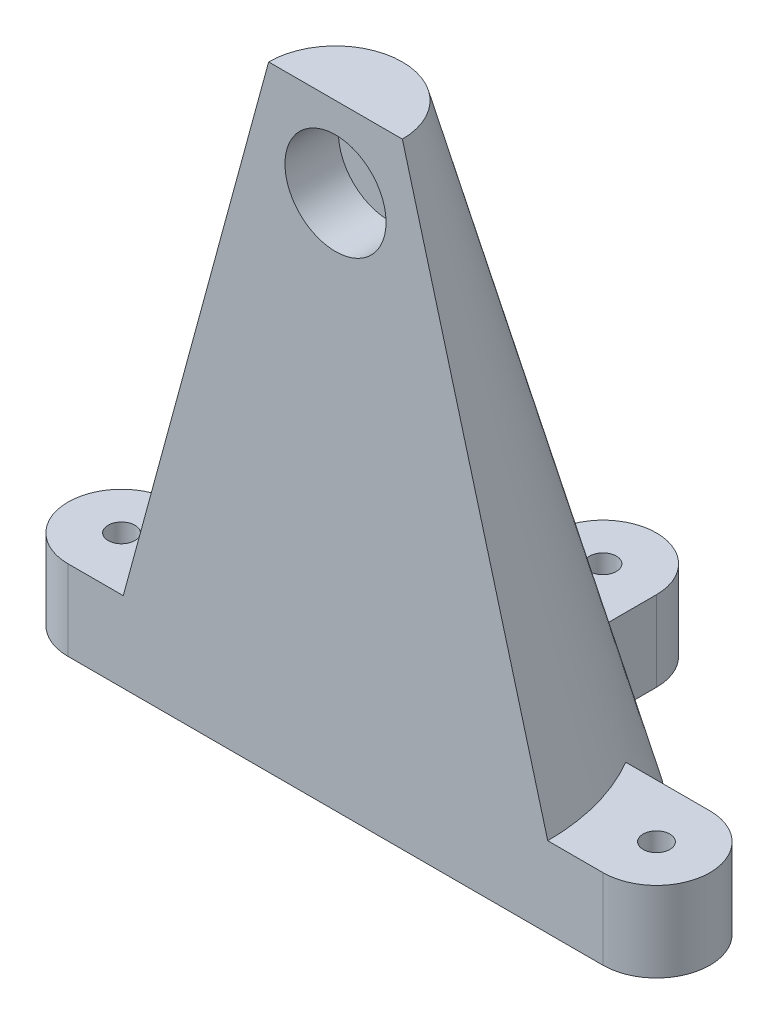
ISO-10303-21;
HEADER;
FILE_DESCRIPTION(('STEP AP214'),'2;1');
FILE_NAME('part.step','',(''),(''),'','','');
FILE_SCHEMA(('AUTOMOTIVE_DESIGN { 1 0 10303 214 1 1 1 1 }'));
ENDSEC;
DATA;
#1=APPLICATION_CONTEXT('core data for automotive mechanical design processes');
#2=APPLICATION_PROTOCOL_DEFINITION('international standard','automotive_design',2000,#1);
#3=PRODUCT_CONTEXT('',#1,'mechanical');
#4=PRODUCT('Part','Part','',(#3));
#5=PRODUCT_RELATED_PRODUCT_CATEGORY('part','',(#4));
#6=PRODUCT_DEFINITION_FORMATION('','',#4);
#7=PRODUCT_DEFINITION_CONTEXT('part definition',#1,'design');
#8=PRODUCT_DEFINITION('design','',#6,#7);
#9=PRODUCT_DEFINITION_SHAPE('','',#8);
#10=(LENGTH_UNIT() NAMED_UNIT(*) SI_UNIT(.MILLI.,.METRE.));
#11=(NAMED_UNIT(*) PLANE_ANGLE_UNIT() SI_UNIT($,.RADIAN.));
#12=(NAMED_UNIT(*) SI_UNIT($,.STERADIAN.) SOLID_ANGLE_UNIT());
#13=UNCERTAINTY_MEASURE_WITH_UNIT(LENGTH_MEASURE(1.E-05),#10,'distance_accuracy_value','');
#14=(GEOMETRIC_REPRESENTATION_CONTEXT(3) GLOBAL_UNCERTAINTY_ASSIGNED_CONTEXT((#13)) GLOBAL_UNIT_ASSIGNED_CONTEXT((#10,
#11,#12)) REPRESENTATION_CONTEXT('',''));
#15=CARTESIAN_POINT('',(0.,0.,0.));
#16=DIRECTION('',(0.,0.,1.));
#17=DIRECTION('',(1.,0.,0.));
#18=AXIS2_PLACEMENT_3D('',#15,#16,#17);
#19=CARTESIAN_POINT('',(0.,0.,0.));
#20=DIRECTION('',(0.,-1.,0.));
#21=DIRECTION('',(0.,0.,-1.));
#22=AXIS2_PLACEMENT_3D('',#19,#20,#21);
#23=CONICAL_SURFACE('',#22,22.225,0.265332086208985);
#24=CARTESIAN_POINT('',(0.,7.62,0.));
#25=DIRECTION('',(0.,-1.,0.));
#26=DIRECTION('',(0.,0.,-1.));
#27=AXIS2_PLACEMENT_3D('',#24,#25,#26);
#28=CIRCLE('',#27,20.154347826087);
#29=CARTESIAN_POINT('',(-20.154347826087,7.62,0.));
#30=VERTEX_POINT('',#29);
#31=CARTESIAN_POINT('',(-17.4060948031112,7.62,-10.16));
#32=VERTEX_POINT('',#31);
#33=EDGE_CURVE('E12',#30,#32,#28,.T.);
#34=ORIENTED_EDGE('',*,*,#33,.F.);
#35=DIRECTION('',(0.26222974761173,0.965005471211168,0.));
#36=VECTOR('',#35,1.);
#37=CARTESIAN_POINT('',(-22.225,0.,0.));
#38=LINE('',#37,#36);
#39=CARTESIAN_POINT('',(-6.35,58.42,0.));
#40=VERTEX_POINT('',#39);
#41=EDGE_CURVE('E187',#30,#40,#38,.T.);
#42=ORIENTED_EDGE('',*,*,#41,.T.);
#43=CARTESIAN_POINT('',(0.,58.42,0.));
#44=DIRECTION('',(0.,1.,0.));
#45=DIRECTION('',(0.,0.,1.));
#46=AXIS2_PLACEMENT_3D('',#43,#44,#45);
#47=CIRCLE('',#46,6.35);
#48=CARTESIAN_POINT('',(6.35,58.42,0.));
#49=VERTEX_POINT('',#48);
#50=EDGE_CURVE('E190',#49,#40,#47,.T.);
#51=ORIENTED_EDGE('',*,*,#50,.F.);
#52=DIRECTION('',(-0.26222974761173,0.965005471211168,0.));
#53=VECTOR('',#52,1.);
#54=CARTESIAN_POINT('',(22.225,0.,0.));
#55=LINE('',#54,#53);
#56=CARTESIAN_POINT('',(20.154347826087,7.62,0.));
#57=VERTEX_POINT('',#56);
#58=EDGE_CURVE('E185',#57,#49,#55,.T.);
#59=ORIENTED_EDGE('',*,*,#58,.F.);
#60=CARTESIAN_POINT('',(17.4060948031112,7.62,-10.16));
#61=VERTEX_POINT('',#60);
#62=EDGE_CURVE('E64',#61,#57,#28,.T.);
#63=ORIENTED_EDGE('',*,*,#62,.F.);
#64=CARTESIAN_POINT('',(25.3642463889337,-18.7622741124216,-10.16));
#65=CARTESIAN_POINT('',(25.0871165658318,-17.8155700283053,-10.16));
#66=CARTESIAN_POINT('',(24.8094126927929,-16.8690340444766,-10.16));
#67=CARTESIAN_POINT('',(24.252726458302,-14.9763374842578,-10.16));
#68=CARTESIAN_POINT('',(23.9737440960321,-14.0301769081083,-10.16));
#69=CARTESIAN_POINT('',(23.1346883236528,-11.1923327800501,-10.16));
#70=CARTESIAN_POINT('',(22.5725021707714,-9.30127295450633,-10.16));
#71=CARTESIAN_POINT('',(21.4412570485107,-5.52165001437487,-10.16));
#72=CARTESIAN_POINT('',(20.8721995763907,-3.63308645192066,-10.16));
#73=CARTESIAN_POINT('',(19.7252332422274,0.141384511547084,-10.16));
#74=CARTESIAN_POINT('',(19.1473242617522,2.02729187665178,-10.16));
#75=CARTESIAN_POINT('',(18.2717718902818,4.85366501147253,-10.16));
#76=CARTESIAN_POINT('',(17.9784434968206,5.79546779936668,-10.16));
#77=CARTESIAN_POINT('',(17.3884559037192,7.67802933954386,-10.16));
#78=CARTESIAN_POINT('',(17.091796707259,8.61878809282267,-10.16));
#79=CARTESIAN_POINT('',(16.4946234039451,10.4990466996067,-10.16));
#80=CARTESIAN_POINT('',(16.1941094294413,11.4385465951167,-10.16));
#81=CARTESIAN_POINT('',(15.5885459761449,13.3160887995716,-10.16));
#82=CARTESIAN_POINT('',(15.2834964800588,14.2541311029436,-10.16));
#83=CARTESIAN_POINT('',(14.6679498115048,16.1286657564603,-10.16));
#84=CARTESIAN_POINT('',(14.357451412934,17.0651577044932,-10.16));
#85=CARTESIAN_POINT('',(13.729991854239,18.9359648873924,-10.16));
#86=CARTESIAN_POINT('',(13.4130307660575,19.8702801463607,-10.16));
#87=CARTESIAN_POINT('',(12.7711843918981,21.7363112939265,-10.16));
#88=CARTESIAN_POINT('',(12.446298211505,22.6680268757809,-10.16));
#89=CARTESIAN_POINT('',(11.9515937033832,24.0630040463354,-10.16));
#90=CARTESIAN_POINT('',(11.7854597200551,24.527572668547,-10.16));
#91=CARTESIAN_POINT('',(11.4504069797889,25.4557087162248,-10.16));
#92=CARTESIAN_POINT('',(11.2814881991404,25.9192761331282,-10.16));
#93=CARTESIAN_POINT('',(11.1110142851986,26.3822741124217,-10.16));
#94=B_SPLINE_CURVE_WITH_KNOTS('',3,(#64,#65,#66,#67,#68,#69,#70,#71,#72,#73,#74,#75,#76,#77,#78,
#79,#80,#81,#82,#83,#84,#85,#86,#87,#88,#89,#90,#91,#92,#93),.UNSPECIFIED.,.F.,.F.,(4,2,2,2,2,2,
2,2,2,2,2,2,2,2,4),(0.,2.95929784260779,5.9185975784092,11.8371536849098,17.7544426124066,
23.6718107816447,26.631080522891,29.5903474391631,32.5495130224944,35.5086898917643,
38.4685413922289,41.4283599615406,44.3885141317393,45.8686482953907,47.3487950678537),.UNSPECIFIED.);
#95=CARTESIAN_POINT('',(19.7667656686672,0.,-10.16));
#96=VERTEX_POINT('',#95);
#97=EDGE_CURVE('E226',#96,#61,#94,.T.);
#98=ORIENTED_EDGE('',*,*,#97,.F.);
#99=CARTESIAN_POINT('',(0.,0.,0.));
#100=DIRECTION('',(0.,1.,0.));
#101=DIRECTION('',(0.,0.,1.));
#102=AXIS2_PLACEMENT_3D('',#99,#100,#101);
#103=CIRCLE('',#102,22.225);
#104=CARTESIAN_POINT('',(5.08,0.,-21.636640797499));
#105=VERTEX_POINT('',#104);
#106=EDGE_CURVE('E176',#96,#105,#103,.T.);
#107=ORIENTED_EDGE('',*,*,#106,.T.);
#108=CARTESIAN_POINT('',(5.08,21.8900502094451,-15.4635653766584));
#109=CARTESIAN_POINT('',(5.08,20.856870997954,-15.7590747938366));
#110=CARTESIAN_POINT('',(5.08,19.8234781379189,-16.0538360037275));
#111=CARTESIAN_POINT('',(5.08,17.7563237907238,-16.6420613973495));
#112=CARTESIAN_POINT('',(5.08,16.7225623037281,-16.9355255816578));
#113=CARTESIAN_POINT('',(5.08,13.6208148882468,-17.8142711198301));
#114=CARTESIAN_POINT('',(5.08,11.5523626463016,-18.3979064182656));
#115=CARTESIAN_POINT('',(5.08,7.41454376474436,-19.5618885615756));
#116=CARTESIAN_POINT('',(5.08,5.3451771292233,-20.142235421005));
#117=CARTESIAN_POINT('',(5.08,1.20573360509191,-21.3003930668656));
#118=CARTESIAN_POINT('',(5.08,-0.864343283801875,-21.8782038522836));
#119=CARTESIAN_POINT('',(5.08,-4.82351338379002,-22.9812539776207));
#120=CARTESIAN_POINT('',(5.08,-6.71256004678796,-23.5066604582315));
#121=CARTESIAN_POINT('',(5.08,-10.4910379665222,-24.5561036385412));
#122=CARTESIAN_POINT('',(5.08,-12.3804692240275,-25.0801403354716));
#123=CARTESIAN_POINT('',(5.08,-14.2700502094451,-25.6036358256929));
#124=B_SPLINE_CURVE_WITH_KNOTS('',3,(#108,#109,#110,#111,#112,#113,#114,#115,#116,#117,#118,
#119,#120,#121,#122,#123),.UNSPECIFIED.,.F.,.F.,(4,2,2,2,2,2,2,4),(0.,3.22382703437352,
6.44765263384408,12.8952933529922,19.3429055121015,25.7905202473498,31.6727763762753,
37.5550443855204),.UNSPECIFIED.);
#125=CARTESIAN_POINT('',(5.08,7.62,-19.5036236708694));
#126=VERTEX_POINT('',#125);
#127=EDGE_CURVE('E197',#126,#105,#124,.T.);
#128=ORIENTED_EDGE('',*,*,#127,.F.);
#129=CARTESIAN_POINT('',(-5.08,7.62,-19.5036236708694));
#130=VERTEX_POINT('',#129);
#131=EDGE_CURVE('E65',#130,#126,#28,.T.);
#132=ORIENTED_EDGE('',*,*,#131,.F.);
#133=CARTESIAN_POINT('',(-5.08,-14.2700502094451,-25.6036358256929));
#134=CARTESIAN_POINT('',(-5.08,-12.7620553135401,-25.1858644445835));
#135=CARTESIAN_POINT('',(-5.08,-11.2541586897674,-24.7677385447827));
#136=CARTESIAN_POINT('',(-5.08,-8.23859798864575,-23.9306486145144));
#137=CARTESIAN_POINT('',(-5.08,-6.73093391131453,-23.5116845839832));
#138=CARTESIAN_POINT('',(-5.08,-2.20835674312999,-22.2533450618456));
#139=CARTESIAN_POINT('',(-5.08,0.80615318566113,-21.4125188446583));
#140=CARTESIAN_POINT('',(-5.08,5.32677284556149,-20.1471720800062));
#141=CARTESIAN_POINT('',(-5.08,6.83345727448637,-19.724704665366));
#142=CARTESIAN_POINT('',(-5.08,9.84635671206079,-18.8781004654417));
#143=CARTESIAN_POINT('',(-5.08,11.3525717208414,-18.4539636806241));
#144=CARTESIAN_POINT('',(-5.08,14.36443468535,-17.6036582088555));
#145=CARTESIAN_POINT('',(-5.08,15.8700826388796,-17.1774895141124));
#146=CARTESIAN_POINT('',(-5.08,18.8806512497353,-16.3225858966291));
#147=CARTESIAN_POINT('',(-5.08,20.3855719063474,-15.893850971375));
#148=CARTESIAN_POINT('',(-5.08,21.8900502094451,-15.4635653766584));
#149=B_SPLINE_CURVE_WITH_KNOTS('',3,(#133,#134,#135,#136,#137,#138,#139,#140,#141,#142,#143,
#144,#145,#146,#147,#148),.UNSPECIFIED.,.F.,.F.,(4,2,2,2,2,2,2,4),(0.,4.6943830244918,
9.38876640533156,18.7774961186876,23.4718739489356,28.166250467184,32.8606450020787,
37.5550441366452),.UNSPECIFIED.);
#150=CARTESIAN_POINT('',(-5.08,0.,-21.636640797499));
#151=VERTEX_POINT('',#150);
#152=EDGE_CURVE('E150',#151,#130,#149,.T.);
#153=ORIENTED_EDGE('',*,*,#152,.F.);
#154=CARTESIAN_POINT('',(-19.7667656686672,0.,-10.16));
#155=VERTEX_POINT('',#154);
#156=EDGE_CURVE('E171',#151,#155,#103,.T.);
#157=ORIENTED_EDGE('',*,*,#156,.T.);
#158=CARTESIAN_POINT('',(-11.1110142851983,26.3822741124215,-10.16));
#159=CARTESIAN_POINT('',(-11.2828877994647,25.9154742206204,-10.16));
#160=CARTESIAN_POINT('',(-11.4531808257251,25.4480956450406,-10.16));
#161=CARTESIAN_POINT('',(-11.7909388525237,24.5123219538872,-10.16));
#162=CARTESIAN_POINT('',(-11.9584038776139,24.0439268471787,-10.16));
#163=CARTESIAN_POINT('',(-12.4570477861834,22.6374524969548,-10.16));
#164=CARTESIAN_POINT('',(-12.7844889081146,21.6980476519393,-10.16));
#165=CARTESIAN_POINT('',(-13.4313425030696,19.8166061913133,-10.16));
#166=CARTESIAN_POINT('',(-13.7507558905817,18.8745698891776,-10.16));
#167=CARTESIAN_POINT('',(-14.3830447997515,16.9882963949149,-10.16));
#168=CARTESIAN_POINT('',(-14.6959202474829,16.0440591780355,-10.16));
#169=CARTESIAN_POINT('',(-15.3161635338036,14.1540189494647,-10.16));
#170=CARTESIAN_POINT('',(-15.6235326151444,13.208216345081,-10.16));
#171=CARTESIAN_POINT('',(-16.2336917444753,11.3151406281748,-10.16));
#172=CARTESIAN_POINT('',(-16.5364818102025,10.3678675213639,-10.16));
#173=CARTESIAN_POINT('',(-17.1381736114701,8.47205212495879,-10.16));
#174=CARTESIAN_POINT('',(-17.4370752125287,7.52350979271322,-10.16));
#175=CARTESIAN_POINT('',(-18.0315210891311,5.62537352080026,-10.16));
#176=CARTESIAN_POINT('',(-18.3270653614527,4.67577958012454,-10.16));
#177=CARTESIAN_POINT('',(-19.1996553610019,1.85696408573224,-10.16));
#178=CARTESIAN_POINT('',(-19.7725410904152,-0.013545519065709,-10.16));
#179=CARTESIAN_POINT('',(-20.9096569860311,-3.75716031677669,-10.16));
#180=CARTESIAN_POINT('',(-21.4738872701346,-5.63026547395453,-10.16));
#181=CARTESIAN_POINT('',(-22.5956143692435,-9.37892022216382,-10.16));
#182=CARTESIAN_POINT('',(-23.1531097387422,-11.2544702454892,-10.16));
#183=CARTESIAN_POINT('',(-23.9852053774903,-14.069027603646,-10.16));
#184=CARTESIAN_POINT('',(-24.2618804311546,-15.0074224585952,-10.16));
#185=CARTESIAN_POINT('',(-24.8139740287771,-16.8845811233188,-10.16));
#186=CARTESIAN_POINT('',(-25.0893925735111,-17.823344932865,-10.16));
#187=CARTESIAN_POINT('',(-25.3642463889337,-18.7622741124216,-10.16));
#188=B_SPLINE_CURVE_WITH_KNOTS('',3,(#158,#159,#160,#161,#162,#163,#164,#165,#166,#167,#168,
#169,#170,#171,#172,#173,#174,#175,#176,#177,#178,#179,#180,#181,#182,#183,#184,#185,#186,#187),
.UNSPECIFIED.,.F.,.F.,(4,2,2,2,2,2,2,2,2,2,2,2,2,2,4),(0.,1.49230062249037,2.98458828258194,
5.96904675706408,8.95316369839891,11.9373143637937,14.9207828177669,17.9042397121448,
20.8877995159848,23.8713621831036,29.7401503503877,35.6088585043029,41.4788046396032,
44.4138007225817,47.3487949930925),.UNSPECIFIED.);
#189=EDGE_CURVE('E52',#32,#155,#188,.T.);
#190=ORIENTED_EDGE('',*,*,#189,.F.);
#191=EDGE_LOOP('',(#34,#42,#51,#59,#63,#98,#107,#128,#132,#153,#157,#190));
#192=FACE_BOUND('',#191,.T.);
#193=ADVANCED_FACE('F48',(#192),#23,.T.);
#194=CARTESIAN_POINT('',(0.,58.42,0.));
#195=DIRECTION('',(0.,1.,0.));
#196=DIRECTION('',(0.,0.,1.));
#197=AXIS2_PLACEMENT_3D('',#194,#195,#196);
#198=PLANE('',#197);
#199=ORIENTED_EDGE('',*,*,#50,.T.);
#200=DIRECTION('',(1.,0.,0.));
#201=VECTOR('',#200,1.);
#202=CARTESIAN_POINT('',(-6.35,58.42,0.));
#203=LINE('',#202,#201);
#204=EDGE_CURVE('E193',#40,#49,#203,.T.);
#205=ORIENTED_EDGE('',*,*,#204,.T.);
#206=EDGE_LOOP('',(#199,#205));
#207=FACE_BOUND('',#206,.T.);
#208=ADVANCED_FACE('F50',(#207),#198,.T.);
#209=CARTESIAN_POINT('',(0.,0.,0.));
#210=DIRECTION('',(0.,1.,0.));
#211=DIRECTION('',(0.,0.,1.));
#212=AXIS2_PLACEMENT_3D('',#209,#210,#211);
#213=PLANE('',#212);
#214=ORIENTED_EDGE('',*,*,#156,.F.);
#215=DIRECTION('',(0.,0.,1.));
#216=VECTOR('',#215,1.);
#217=CARTESIAN_POINT('',(-5.08,0.,-25.4));
#218=LINE('',#217,#216);
#219=CARTESIAN_POINT('',(-5.08,0.,-25.4));
#220=VERTEX_POINT('',#219);
#221=EDGE_CURVE('E296',#220,#151,#218,.T.);
#222=ORIENTED_EDGE('',*,*,#221,.F.);
#223=CARTESIAN_POINT('',(0.,0.,-25.4));
#224=DIRECTION('',(0.,1.,0.));
#225=DIRECTION('',(0.,0.,-1.));
#226=AXIS2_PLACEMENT_3D('',#223,#224,#225);
#227=CIRCLE('',#226,5.08);
#228=CARTESIAN_POINT('',(5.08,0.,-25.4));
#229=VERTEX_POINT('',#228);
#230=EDGE_CURVE('E169',#229,#220,#227,.T.);
#231=ORIENTED_EDGE('',*,*,#230,.F.);
#232=DIRECTION('',(0.,0.,-1.));
#233=VECTOR('',#232,1.);
#234=CARTESIAN_POINT('',(5.08,0.,-25.4));
#235=LINE('',#234,#233);
#236=EDGE_CURVE('E165',#105,#229,#235,.T.);
#237=ORIENTED_EDGE('',*,*,#236,.F.);
#238=ORIENTED_EDGE('',*,*,#106,.F.);
#239=DIRECTION('',(-1.,0.,0.));
#240=VECTOR('',#239,1.);
#241=CARTESIAN_POINT('',(5.08,0.,-10.16));
#242=LINE('',#241,#240);
#243=CARTESIAN_POINT('',(25.4,0.,-10.16));
#244=VERTEX_POINT('',#243);
#245=EDGE_CURVE('E310',#244,#96,#242,.T.);
#246=ORIENTED_EDGE('',*,*,#245,.F.);
#247=CARTESIAN_POINT('',(25.4,0.,-5.08));
#248=DIRECTION('',(0.,1.,0.));
#249=DIRECTION('',(0.,0.,-1.));
#250=AXIS2_PLACEMENT_3D('',#247,#248,#249);
#251=CIRCLE('',#250,5.08);
#252=CARTESIAN_POINT('',(25.4,0.,0.));
#253=VERTEX_POINT('',#252);
#254=EDGE_CURVE('E307',#253,#244,#251,.T.);
#255=ORIENTED_EDGE('',*,*,#254,.F.);
#256=DIRECTION('',(1.,0.,0.));
#257=VECTOR('',#256,1.);
#258=CARTESIAN_POINT('',(-22.225,0.,0.));
#259=LINE('',#258,#257);
#260=CARTESIAN_POINT('',(-25.4,0.,0.));
#261=VERTEX_POINT('',#260);
#262=EDGE_CURVE('E183',#261,#253,#259,.T.);
#263=ORIENTED_EDGE('',*,*,#262,.F.);
#264=CARTESIAN_POINT('',(-25.4,0.,-5.08));
#265=DIRECTION('',(0.,1.,0.));
#266=DIRECTION('',(0.,0.,1.));
#267=AXIS2_PLACEMENT_3D('',#264,#265,#266);
#268=CIRCLE('',#267,5.08);
#269=CARTESIAN_POINT('',(-25.4,0.,-10.16));
#270=VERTEX_POINT('',#269);
#271=EDGE_CURVE('E303',#270,#261,#268,.T.);
#272=ORIENTED_EDGE('',*,*,#271,.F.);
#273=DIRECTION('',(-1.,0.,0.));
#274=VECTOR('',#273,1.);
#275=CARTESIAN_POINT('',(-5.08,0.,-10.16));
#276=LINE('',#275,#274);
#277=EDGE_CURVE('E300',#155,#270,#276,.T.);
#278=ORIENTED_EDGE('',*,*,#277,.F.);
#279=EDGE_LOOP('',(#214,#222,#231,#237,#238,#246,#255,#263,#272,#278));
#280=FACE_BOUND('',#279,.T.);
#281=CARTESIAN_POINT('',(0.,0.,-25.4));
#282=DIRECTION('',(0.,1.,0.));
#283=DIRECTION('',(0.,0.,1.));
#284=AXIS2_PLACEMENT_3D('',#281,#282,#283);
#285=CIRCLE('',#284,1.27);
#286=CARTESIAN_POINT('',(0.,0.,-26.67));
#287=VERTEX_POINT('',#286);
#288=EDGE_CURVE('E368',#287,#287,#285,.T.);
#289=ORIENTED_EDGE('',*,*,#288,.T.);
#290=EDGE_LOOP('',(#289));
#291=FACE_BOUND('',#290,.T.);
#292=CARTESIAN_POINT('',(-25.4,0.,-5.08));
#293=DIRECTION('',(0.,1.,0.));
#294=DIRECTION('',(0.,0.,-1.));
#295=AXIS2_PLACEMENT_3D('',#292,#293,#294);
#296=CIRCLE('',#295,1.27);
#297=CARTESIAN_POINT('',(-25.4,0.,-6.35));
#298=VERTEX_POINT('',#297);
#299=EDGE_CURVE('E352',#298,#298,#296,.T.);
#300=ORIENTED_EDGE('',*,*,#299,.T.);
#301=EDGE_LOOP('',(#300));
#302=FACE_BOUND('',#301,.T.);
#303=CARTESIAN_POINT('',(25.4,0.,-5.08));
#304=DIRECTION('',(0.,1.,0.));
#305=DIRECTION('',(0.,0.,1.));
#306=AXIS2_PLACEMENT_3D('',#303,#304,#305);
#307=CIRCLE('',#306,1.27);
#308=CARTESIAN_POINT('',(25.4,0.,-6.35));
#309=VERTEX_POINT('',#308);
#310=EDGE_CURVE('E360',#309,#309,#307,.T.);
#311=ORIENTED_EDGE('',*,*,#310,.T.);
#312=EDGE_LOOP('',(#311));
#313=FACE_BOUND('',#312,.T.);
#314=ADVANCED_FACE('F247',(#280,#291,#302,#313),#213,.F.);
#315=CARTESIAN_POINT('',(0.,0.,0.));
#316=DIRECTION('',(0.,0.,-1.));
#317=DIRECTION('',(-1.,0.,0.));
#318=AXIS2_PLACEMENT_3D('',#315,#316,#317);
#319=PLANE('',#318);
#320=CARTESIAN_POINT('',(0.,50.8,0.));
#321=DIRECTION('',(0.,0.,1.));
#322=DIRECTION('',(1.,0.,0.));
#323=AXIS2_PLACEMENT_3D('',#320,#321,#322);
#324=CIRCLE('',#323,4.8006);
#325=CARTESIAN_POINT('',(4.8006,50.8,0.));
#326=VERTEX_POINT('',#325);
#327=EDGE_CURVE('E376',#326,#326,#324,.T.);
#328=ORIENTED_EDGE('',*,*,#327,.F.);
#329=EDGE_LOOP('',(#328));
#330=FACE_BOUND('',#329,.T.);
#331=ORIENTED_EDGE('',*,*,#262,.T.);
#332=DIRECTION('',(0.,-1.,0.));
#333=VECTOR('',#332,1.);
#334=CARTESIAN_POINT('',(25.4,7.62,0.));
#335=LINE('',#334,#333);
#336=CARTESIAN_POINT('',(25.4,7.62,0.));
#337=VERTEX_POINT('',#336);
#338=EDGE_CURVE('E322',#337,#253,#335,.T.);
#339=ORIENTED_EDGE('',*,*,#338,.F.);
#340=DIRECTION('',(1.,0.,0.));
#341=VECTOR('',#340,1.);
#342=CARTESIAN_POINT('',(25.4,7.62,0.));
#343=LINE('',#342,#341);
#344=EDGE_CURVE('E279',#57,#337,#343,.T.);
#345=ORIENTED_EDGE('',*,*,#344,.F.);
#346=ORIENTED_EDGE('',*,*,#58,.T.);
#347=ORIENTED_EDGE('',*,*,#204,.F.);
#348=ORIENTED_EDGE('',*,*,#41,.F.);
#349=CARTESIAN_POINT('',(-25.4,7.62,0.));
#350=VERTEX_POINT('',#349);
#351=EDGE_CURVE('E271',#350,#30,#343,.T.);
#352=ORIENTED_EDGE('',*,*,#351,.F.);
#353=DIRECTION('',(0.,-1.,0.));
#354=VECTOR('',#353,1.);
#355=CARTESIAN_POINT('',(-25.4,7.62,0.));
#356=LINE('',#355,#354);
#357=EDGE_CURVE('E179',#350,#261,#356,.T.);
#358=ORIENTED_EDGE('',*,*,#357,.T.);
#359=EDGE_LOOP('',(#331,#339,#345,#346,#347,#348,#352,#358));
#360=FACE_BOUND('',#359,.T.);
#361=ADVANCED_FACE('F249',(#330,#360),#319,.F.);
#362=CARTESIAN_POINT('',(0.,7.62,-25.4));
#363=DIRECTION('',(0.,-1.,0.));
#364=DIRECTION('',(0.,0.,-1.));
#365=AXIS2_PLACEMENT_3D('',#362,#363,#364);
#366=CYLINDRICAL_SURFACE('',#365,1.27);
#367=CARTESIAN_POINT('',(0.,7.62,-25.4));
#368=DIRECTION('',(0.,1.,0.));
#369=DIRECTION('',(0.,0.,1.));
#370=AXIS2_PLACEMENT_3D('',#367,#368,#369);
#371=CIRCLE('',#370,1.27);
#372=CARTESIAN_POINT('',(0.,7.62,-26.67));
#373=VERTEX_POINT('',#372);
#374=EDGE_CURVE('E364',#373,#373,#371,.T.);
#375=CARTESIAN_POINT('',(0.,7.62,-26.67));
#376=CARTESIAN_POINT('',(0.,7.540625,-26.67));
#377=CARTESIAN_POINT('',(0.,7.46125,-26.67));
#378=CARTESIAN_POINT('',(0.,7.3025,-26.67));
#379=CARTESIAN_POINT('',(0.,7.223125,-26.67));
#380=CARTESIAN_POINT('',(0.,7.064375,-26.67));
#381=CARTESIAN_POINT('',(0.,6.985,-26.67));
#382=CARTESIAN_POINT('',(0.,6.82625,-26.67));
#383=CARTESIAN_POINT('',(0.,6.746875,-26.67));
#384=CARTESIAN_POINT('',(0.,6.588125,-26.67));
#385=CARTESIAN_POINT('',(0.,6.50875,-26.67));
#386=CARTESIAN_POINT('',(0.,6.35,-26.67));
#387=CARTESIAN_POINT('',(0.,6.270625,-26.67));
#388=CARTESIAN_POINT('',(0.,6.111875,-26.67));
#389=CARTESIAN_POINT('',(0.,6.0325,-26.67));
#390=CARTESIAN_POINT('',(0.,5.87375,-26.67));
#391=CARTESIAN_POINT('',(0.,5.794375,-26.67));
#392=CARTESIAN_POINT('',(0.,5.635625,-26.67));
#393=CARTESIAN_POINT('',(0.,5.55625,-26.67));
#394=CARTESIAN_POINT('',(0.,5.3975,-26.67));
#395=CARTESIAN_POINT('',(0.,5.318125,-26.67));
#396=CARTESIAN_POINT('',(0.,5.159375,-26.67));
#397=CARTESIAN_POINT('',(0.,5.08,-26.67));
#398=CARTESIAN_POINT('',(0.,4.92125,-26.67));
#399=CARTESIAN_POINT('',(0.,4.841875,-26.67));
#400=CARTESIAN_POINT('',(0.,4.683125,-26.67));
#401=CARTESIAN_POINT('',(0.,4.60375,-26.67));
#402=CARTESIAN_POINT('',(0.,4.445,-26.67));
#403=CARTESIAN_POINT('',(0.,4.365625,-26.67));
#404=CARTESIAN_POINT('',(0.,4.206875,-26.67));
#405=CARTESIAN_POINT('',(0.,4.1275,-26.67));
#406=CARTESIAN_POINT('',(0.,3.96875,-26.67));
#407=CARTESIAN_POINT('',(0.,3.889375,-26.67));
#408=CARTESIAN_POINT('',(0.,3.730625,-26.67));
#409=CARTESIAN_POINT('',(0.,3.65125,-26.67));
#410=CARTESIAN_POINT('',(0.,3.4925,-26.67));
#411=CARTESIAN_POINT('',(0.,3.413125,-26.67));
#412=CARTESIAN_POINT('',(0.,3.254375,-26.67));
#413=CARTESIAN_POINT('',(0.,3.175,-26.67));
#414=CARTESIAN_POINT('',(0.,3.01625,-26.67));
#415=CARTESIAN_POINT('',(0.,2.936875,-26.67));
#416=CARTESIAN_POINT('',(0.,2.778125,-26.67));
#417=CARTESIAN_POINT('',(0.,2.69875,-26.67));
#418=CARTESIAN_POINT('',(0.,2.54,-26.67));
#419=CARTESIAN_POINT('',(0.,2.460625,-26.67));
#420=CARTESIAN_POINT('',(0.,2.301875,-26.67));
#421=CARTESIAN_POINT('',(0.,2.2225,-26.67));
#422=CARTESIAN_POINT('',(0.,2.06375,-26.67));
#423=CARTESIAN_POINT('',(0.,1.984375,-26.67));
#424=CARTESIAN_POINT('',(0.,1.825625,-26.67));
#425=CARTESIAN_POINT('',(0.,1.74625,-26.67));
#426=CARTESIAN_POINT('',(0.,1.5875,-26.67));
#427=CARTESIAN_POINT('',(0.,1.508125,-26.67));
#428=CARTESIAN_POINT('',(0.,1.349375,-26.67));
#429=CARTESIAN_POINT('',(0.,1.27,-26.67));
#430=CARTESIAN_POINT('',(0.,1.11125,-26.67));
#431=CARTESIAN_POINT('',(0.,1.031875,-26.67));
#432=CARTESIAN_POINT('',(0.,0.873125,-26.67));
#433=CARTESIAN_POINT('',(0.,0.79375,-26.67));
#434=CARTESIAN_POINT('',(0.,0.635,-26.67));
#435=CARTESIAN_POINT('',(0.,0.555625,-26.67));
#436=CARTESIAN_POINT('',(0.,0.396875,-26.67));
#437=CARTESIAN_POINT('',(0.,0.3175,-26.67));
#438=CARTESIAN_POINT('',(0.,0.15875,-26.67));
#439=CARTESIAN_POINT('',(0.,0.0793749999999999,-26.67));
#440=CARTESIAN_POINT('',(0.,0.,-26.67));
#441=B_SPLINE_CURVE_WITH_KNOTS('',3,(#375,#376,#377,#378,#379,#380,#381,#382,#383,#384,#385,
#386,#387,#388,#389,#390,#391,#392,#393,#394,#395,#396,#397,#398,#399,#400,#401,#402,#403,#404,
#405,#406,#407,#408,#409,#410,#411,#412,#413,#414,#415,#416,#417,#418,#419,#420,#421,#422,#423,
#424,#425,#426,#427,#428,#429,#430,#431,#432,#433,#434,#435,#436,#437,#438,#439,#440),
.UNSPECIFIED.,.F.,.F.,(4,2,2,2,2,2,2,2,2,2,2,2,2,2,2,2,2,2,2,2,2,2,2,2,2,2,2,2,2,2,2,2,4),(0.,
0.238125,0.47625,0.714375000000001,0.9525,1.190625,1.42875,1.666875,1.905,2.143125,2.38125,
2.619375,2.8575,3.095625,3.33375,3.571875,3.81,4.048125,4.28625,4.524375,4.7625,5.000625,
5.23875,5.476875,5.715,5.953125,6.19125,6.429375,6.6675,6.905625,7.14375,7.381875,7.62),.UNSPECIFIED.);
#442=EDGE_CURVE('BSEAM246',#373,#287,#441,.T.);
#443=ORIENTED_EDGE('',*,*,#374,.T.);
#444=ORIENTED_EDGE('',*,*,#288,.F.);
#445=ORIENTED_EDGE('',*,*,#442,.T.);
#446=ORIENTED_EDGE('',*,*,#442,.F.);
#447=EDGE_LOOP('',(#443,#445,#444,#446));
#448=FACE_BOUND('',#447,.T.);
#449=ADVANCED_FACE('F246',(#448),#366,.F.);
#450=CARTESIAN_POINT('',(0.,7.62,-25.4));
#451=DIRECTION('',(0.,-1.,0.));
#452=DIRECTION('',(0.,0.,-1.));
#453=AXIS2_PLACEMENT_3D('',#450,#451,#452);
#454=CYLINDRICAL_SURFACE('',#453,5.08);
#455=ORIENTED_EDGE('',*,*,#230,.T.);
#456=DIRECTION('',(0.,-1.,0.));
#457=VECTOR('',#456,1.);
#458=CARTESIAN_POINT('',(-5.08,7.62,-25.4));
#459=LINE('',#458,#457);
#460=CARTESIAN_POINT('',(-5.08,7.62,-25.4));
#461=VERTEX_POINT('',#460);
#462=EDGE_CURVE('E148',#461,#220,#459,.T.);
#463=ORIENTED_EDGE('',*,*,#462,.F.);
#464=CARTESIAN_POINT('',(0.,7.62,-25.4));
#465=DIRECTION('',(0.,1.,0.));
#466=DIRECTION('',(0.,0.,-1.));
#467=AXIS2_PLACEMENT_3D('',#464,#465,#466);
#468=CIRCLE('',#467,5.08);
#469=CARTESIAN_POINT('',(5.08,7.62,-25.4));
#470=VERTEX_POINT('',#469);
#471=EDGE_CURVE('E154',#470,#461,#468,.T.);
#472=ORIENTED_EDGE('',*,*,#471,.F.);
#473=DIRECTION('',(0.,-1.,0.));
#474=VECTOR('',#473,1.);
#475=CARTESIAN_POINT('',(5.08,7.62,-25.4));
#476=LINE('',#475,#474);
#477=EDGE_CURVE('E293',#470,#229,#476,.T.);
#478=ORIENTED_EDGE('',*,*,#477,.T.);
#479=EDGE_LOOP('',(#455,#463,#472,#478));
#480=FACE_BOUND('',#479,.T.);
#481=ADVANCED_FACE('F167',(#480),#454,.T.);
#482=CARTESIAN_POINT('',(5.08,7.62,-25.4));
#483=DIRECTION('',(-1.,0.,0.));
#484=DIRECTION('',(0.,0.,1.));
#485=AXIS2_PLACEMENT_3D('',#482,#483,#484);
#486=PLANE('',#485);
#487=DIRECTION('',(0.,0.,-1.));
#488=VECTOR('',#487,1.);
#489=CARTESIAN_POINT('',(5.08,7.62,-25.4));
#490=LINE('',#489,#488);
#491=EDGE_CURVE('E160',#126,#470,#490,.T.);
#492=ORIENTED_EDGE('',*,*,#491,.F.);
#493=ORIENTED_EDGE('',*,*,#127,.T.);
#494=ORIENTED_EDGE('',*,*,#236,.T.);
#495=ORIENTED_EDGE('',*,*,#477,.F.);
#496=EDGE_LOOP('',(#492,#493,#494,#495));
#497=FACE_BOUND('',#496,.T.);
#498=ADVANCED_FACE('F211',(#497),#486,.F.);
#499=CARTESIAN_POINT('',(-5.08,7.62,-25.4));
#500=DIRECTION('',(1.,0.,0.));
#501=DIRECTION('',(0.,0.,-1.));
#502=AXIS2_PLACEMENT_3D('',#499,#500,#501);
#503=PLANE('',#502);
#504=ORIENTED_EDGE('',*,*,#221,.T.);
#505=ORIENTED_EDGE('',*,*,#152,.T.);
#506=DIRECTION('',(0.,0.,1.));
#507=VECTOR('',#506,1.);
#508=CARTESIAN_POINT('',(-5.08,7.62,-25.4));
#509=LINE('',#508,#507);
#510=EDGE_CURVE('E143',#461,#130,#509,.T.);
#511=ORIENTED_EDGE('',*,*,#510,.F.);
#512=ORIENTED_EDGE('',*,*,#462,.T.);
#513=EDGE_LOOP('',(#504,#505,#511,#512));
#514=FACE_BOUND('',#513,.T.);
#515=ADVANCED_FACE('F146',(#514),#503,.F.);
#516=CARTESIAN_POINT('',(0.,7.62,-25.4));
#517=DIRECTION('',(0.,-1.,0.));
#518=DIRECTION('',(0.,0.,-1.));
#519=AXIS2_PLACEMENT_3D('',#516,#517,#518);
#520=PLANE('',#519);
#521=ORIENTED_EDGE('',*,*,#510,.T.);
#522=ORIENTED_EDGE('',*,*,#131,.T.);
#523=ORIENTED_EDGE('',*,*,#491,.T.);
#524=ORIENTED_EDGE('',*,*,#471,.T.);
#525=EDGE_LOOP('',(#521,#522,#523,#524));
#526=FACE_BOUND('',#525,.T.);
#527=ORIENTED_EDGE('',*,*,#374,.F.);
#528=EDGE_LOOP('',(#527));
#529=FACE_BOUND('',#528,.T.);
#530=ADVANCED_FACE('F157',(#526,#529),#520,.F.);
#531=CARTESIAN_POINT('',(25.4,7.62,-5.08));
#532=DIRECTION('',(0.,-1.,0.));
#533=DIRECTION('',(0.,0.,-1.));
#534=AXIS2_PLACEMENT_3D('',#531,#532,#533);
#535=CYLINDRICAL_SURFACE('',#534,1.27);
#536=CARTESIAN_POINT('',(25.4,7.62,-5.08));
#537=DIRECTION('',(0.,1.,0.));
#538=DIRECTION('',(0.,0.,1.));
#539=AXIS2_PLACEMENT_3D('',#536,#537,#538);
#540=CIRCLE('',#539,1.27);
#541=CARTESIAN_POINT('',(25.4,7.62,-6.35));
#542=VERTEX_POINT('',#541);
#543=EDGE_CURVE('E356',#542,#542,#540,.T.);
#544=CARTESIAN_POINT('',(25.4,7.62,-6.35));
#545=CARTESIAN_POINT('',(25.4,7.540625,-6.35));
#546=CARTESIAN_POINT('',(25.4,7.46125,-6.35));
#547=CARTESIAN_POINT('',(25.4,7.3025,-6.35));
#548=CARTESIAN_POINT('',(25.4,7.223125,-6.35));
#549=CARTESIAN_POINT('',(25.4,7.064375,-6.35));
#550=CARTESIAN_POINT('',(25.4,6.985,-6.35));
#551=CARTESIAN_POINT('',(25.4,6.82625,-6.35));
#552=CARTESIAN_POINT('',(25.4,6.746875,-6.35));
#553=CARTESIAN_POINT('',(25.4,6.588125,-6.35));
#554=CARTESIAN_POINT('',(25.4,6.50875,-6.35));
#555=CARTESIAN_POINT('',(25.4,6.35,-6.35));
#556=CARTESIAN_POINT('',(25.4,6.270625,-6.35));
#557=CARTESIAN_POINT('',(25.4,6.111875,-6.35));
#558=CARTESIAN_POINT('',(25.4,6.0325,-6.35));
#559=CARTESIAN_POINT('',(25.4,5.87375,-6.35));
#560=CARTESIAN_POINT('',(25.4,5.794375,-6.35));
#561=CARTESIAN_POINT('',(25.4,5.635625,-6.35));
#562=CARTESIAN_POINT('',(25.4,5.55625,-6.35));
#563=CARTESIAN_POINT('',(25.4,5.3975,-6.35));
#564=CARTESIAN_POINT('',(25.4,5.318125,-6.35));
#565=CARTESIAN_POINT('',(25.4,5.159375,-6.35));
#566=CARTESIAN_POINT('',(25.4,5.08,-6.35));
#567=CARTESIAN_POINT('',(25.4,4.92125,-6.35));
#568=CARTESIAN_POINT('',(25.4,4.841875,-6.35));
#569=CARTESIAN_POINT('',(25.4,4.683125,-6.35));
#570=CARTESIAN_POINT('',(25.4,4.60375,-6.35));
#571=CARTESIAN_POINT('',(25.4,4.445,-6.35));
#572=CARTESIAN_POINT('',(25.4,4.365625,-6.35));
#573=CARTESIAN_POINT('',(25.4,4.206875,-6.35));
#574=CARTESIAN_POINT('',(25.4,4.1275,-6.35));
#575=CARTESIAN_POINT('',(25.4,3.96875,-6.35));
#576=CARTESIAN_POINT('',(25.4,3.889375,-6.35));
#577=CARTESIAN_POINT('',(25.4,3.730625,-6.35));
#578=CARTESIAN_POINT('',(25.4,3.65125,-6.35));
#579=CARTESIAN_POINT('',(25.4,3.4925,-6.35));
#580=CARTESIAN_POINT('',(25.4,3.413125,-6.35));
#581=CARTESIAN_POINT('',(25.4,3.254375,-6.35));
#582=CARTESIAN_POINT('',(25.4,3.175,-6.35));
#583=CARTESIAN_POINT('',(25.4,3.01625,-6.35));
#584=CARTESIAN_POINT('',(25.4,2.936875,-6.35));
#585=CARTESIAN_POINT('',(25.4,2.778125,-6.35));
#586=CARTESIAN_POINT('',(25.4,2.69875,-6.35));
#587=CARTESIAN_POINT('',(25.4,2.54,-6.35));
#588=CARTESIAN_POINT('',(25.4,2.460625,-6.35));
#589=CARTESIAN_POINT('',(25.4,2.301875,-6.35));
#590=CARTESIAN_POINT('',(25.4,2.2225,-6.35));
#591=CARTESIAN_POINT('',(25.4,2.06375,-6.35));
#592=CARTESIAN_POINT('',(25.4,1.984375,-6.35));
#593=CARTESIAN_POINT('',(25.4,1.825625,-6.35));
#594=CARTESIAN_POINT('',(25.4,1.74625,-6.35));
#595=CARTESIAN_POINT('',(25.4,1.5875,-6.35));
#596=CARTESIAN_POINT('',(25.4,1.508125,-6.35));
#597=CARTESIAN_POINT('',(25.4,1.349375,-6.35));
#598=CARTESIAN_POINT('',(25.4,1.27,-6.35));
#599=CARTESIAN_POINT('',(25.4,1.11125,-6.35));
#600=CARTESIAN_POINT('',(25.4,1.031875,-6.35));
#601=CARTESIAN_POINT('',(25.4,0.873125,-6.35));
#602=CARTESIAN_POINT('',(25.4,0.79375,-6.35));
#603=CARTESIAN_POINT('',(25.4,0.635,-6.35));
#604=CARTESIAN_POINT('',(25.4,0.555625,-6.35));
#605=CARTESIAN_POINT('',(25.4,0.396875,-6.35));
#606=CARTESIAN_POINT('',(25.4,0.3175,-6.35));
#607=CARTESIAN_POINT('',(25.4,0.15875,-6.35));
#608=CARTESIAN_POINT('',(25.4,0.0793749999999999,-6.35));
#609=CARTESIAN_POINT('',(25.4,0.,-6.35));
#610=B_SPLINE_CURVE_WITH_KNOTS('',3,(#544,#545,#546,#547,#548,#549,#550,#551,#552,#553,#554,
#555,#556,#557,#558,#559,#560,#561,#562,#563,#564,#565,#566,#567,#568,#569,#570,#571,#572,#573,
#574,#575,#576,#577,#578,#579,#580,#581,#582,#583,#584,#585,#586,#587,#588,#589,#590,#591,#592,
#593,#594,#595,#596,#597,#598,#599,#600,#601,#602,#603,#604,#605,#606,#607,#608,#609),
.UNSPECIFIED.,.F.,.F.,(4,2,2,2,2,2,2,2,2,2,2,2,2,2,2,2,2,2,2,2,2,2,2,2,2,2,2,2,2,2,2,2,4),(0.,
0.238125,0.47625,0.714375000000001,0.9525,1.190625,1.42875,1.666875,1.905,2.143125,2.38125,
2.619375,2.8575,3.095625,3.33375,3.571875,3.81,4.048125,4.28625,4.524375,4.7625,5.000625,
5.23875,5.476875,5.715,5.953125,6.19125,6.429375,6.6675,6.905625,7.14375,7.381875,7.62),.UNSPECIFIED.);
#611=EDGE_CURVE('BSEAM398',#542,#309,#610,.T.);
#612=ORIENTED_EDGE('',*,*,#543,.T.);
#613=ORIENTED_EDGE('',*,*,#310,.F.);
#614=ORIENTED_EDGE('',*,*,#611,.T.);
#615=ORIENTED_EDGE('',*,*,#611,.F.);
#616=EDGE_LOOP('',(#612,#614,#613,#615));
#617=FACE_BOUND('',#616,.T.);
#618=ADVANCED_FACE('F398',(#617),#535,.F.);
#619=CARTESIAN_POINT('',(25.4,7.62,-5.08));
#620=DIRECTION('',(0.,-1.,0.));
#621=DIRECTION('',(0.,0.,-1.));
#622=AXIS2_PLACEMENT_3D('',#619,#620,#621);
#623=CYLINDRICAL_SURFACE('',#622,5.08);
#624=ORIENTED_EDGE('',*,*,#254,.T.);
#625=DIRECTION('',(0.,-1.,0.));
#626=VECTOR('',#625,1.);
#627=CARTESIAN_POINT('',(25.4,7.62,-10.16));
#628=LINE('',#627,#626);
#629=CARTESIAN_POINT('',(25.4,7.62,-10.16));
#630=VERTEX_POINT('',#629);
#631=EDGE_CURVE('E318',#630,#244,#628,.T.);
#632=ORIENTED_EDGE('',*,*,#631,.F.);
#633=CARTESIAN_POINT('',(25.4,7.62,-5.08));
#634=DIRECTION('',(0.,1.,0.));
#635=DIRECTION('',(0.,0.,-1.));
#636=AXIS2_PLACEMENT_3D('',#633,#634,#635);
#637=CIRCLE('',#636,5.08);
#638=EDGE_CURVE('E278',#337,#630,#637,.T.);
#639=ORIENTED_EDGE('',*,*,#638,.F.);
#640=ORIENTED_EDGE('',*,*,#338,.T.);
#641=EDGE_LOOP('',(#624,#632,#639,#640));
#642=FACE_BOUND('',#641,.T.);
#643=ADVANCED_FACE('F223',(#642),#623,.T.);
#644=CARTESIAN_POINT('',(5.08,7.62,-10.16));
#645=DIRECTION('',(0.,0.,1.));
#646=DIRECTION('',(1.,0.,0.));
#647=AXIS2_PLACEMENT_3D('',#644,#645,#646);
#648=PLANE('',#647);
#649=ORIENTED_EDGE('',*,*,#245,.T.);
#650=ORIENTED_EDGE('',*,*,#97,.T.);
#651=DIRECTION('',(-1.,0.,0.));
#652=VECTOR('',#651,1.);
#653=CARTESIAN_POINT('',(5.08,7.62,-10.16));
#654=LINE('',#653,#652);
#655=EDGE_CURVE('E283',#630,#61,#654,.T.);
#656=ORIENTED_EDGE('',*,*,#655,.F.);
#657=ORIENTED_EDGE('',*,*,#631,.T.);
#658=EDGE_LOOP('',(#649,#650,#656,#657));
#659=FACE_BOUND('',#658,.T.);
#660=ADVANCED_FACE('F218',(#659),#648,.F.);
#661=ORIENTED_EDGE('',*,*,#543,.F.);
#662=EDGE_LOOP('',(#661));
#663=FACE_BOUND('',#662,.T.);
#664=ORIENTED_EDGE('',*,*,#655,.T.);
#665=ORIENTED_EDGE('',*,*,#62,.T.);
#666=ORIENTED_EDGE('',*,*,#344,.T.);
#667=ORIENTED_EDGE('',*,*,#638,.T.);
#668=EDGE_LOOP('',(#664,#665,#666,#667));
#669=FACE_BOUND('',#668,.T.);
#670=ADVANCED_FACE('F222',(#663,#669),#520,.F.);
#671=CARTESIAN_POINT('',(-25.4,7.62,-5.08));
#672=DIRECTION('',(0.,1.,0.));
#673=DIRECTION('',(0.,0.,-1.));
#674=AXIS2_PLACEMENT_3D('',#671,#672,#673);
#675=CIRCLE('',#674,1.27);
#676=CARTESIAN_POINT('',(-25.4,7.62,-6.35));
#677=VERTEX_POINT('',#676);
#678=EDGE_CURVE('E297',#677,#677,#675,.T.);
#679=ORIENTED_EDGE('',*,*,#678,.F.);
#680=EDGE_LOOP('',(#679));
#681=FACE_BOUND('',#680,.T.);
#682=ORIENTED_EDGE('',*,*,#351,.T.);
#683=ORIENTED_EDGE('',*,*,#33,.T.);
#684=DIRECTION('',(-1.,0.,0.));
#685=VECTOR('',#684,1.);
#686=CARTESIAN_POINT('',(-5.08,7.62,-10.16));
#687=LINE('',#686,#685);
#688=CARTESIAN_POINT('',(-25.4,7.62,-10.16));
#689=VERTEX_POINT('',#688);
#690=EDGE_CURVE('E153',#32,#689,#687,.T.);
#691=ORIENTED_EDGE('',*,*,#690,.T.);
#692=CARTESIAN_POINT('',(-25.4,7.62,-5.08));
#693=DIRECTION('',(0.,1.,0.));
#694=DIRECTION('',(0.,0.,1.));
#695=AXIS2_PLACEMENT_3D('',#692,#693,#694);
#696=CIRCLE('',#695,5.08);
#697=EDGE_CURVE('E274',#689,#350,#696,.T.);
#698=ORIENTED_EDGE('',*,*,#697,.T.);
#699=EDGE_LOOP('',(#682,#683,#691,#698));
#700=FACE_BOUND('',#699,.T.);
#701=ADVANCED_FACE('F272',(#681,#700),#520,.F.);
#702=CARTESIAN_POINT('',(-5.08,7.62,-10.16));
#703=DIRECTION('',(0.,0.,1.));
#704=DIRECTION('',(1.,0.,0.));
#705=AXIS2_PLACEMENT_3D('',#702,#703,#704);
#706=PLANE('',#705);
#707=ORIENTED_EDGE('',*,*,#690,.F.);
#708=ORIENTED_EDGE('',*,*,#189,.T.);
#709=ORIENTED_EDGE('',*,*,#277,.T.);
#710=DIRECTION('',(0.,-1.,0.));
#711=VECTOR('',#710,1.);
#712=CARTESIAN_POINT('',(-25.4,7.62,-10.16));
#713=LINE('',#712,#711);
#714=EDGE_CURVE('E172',#689,#270,#713,.T.);
#715=ORIENTED_EDGE('',*,*,#714,.F.);
#716=EDGE_LOOP('',(#707,#708,#709,#715));
#717=FACE_BOUND('',#716,.T.);
#718=ADVANCED_FACE('F242',(#717),#706,.F.);
#719=CARTESIAN_POINT('',(-25.4,7.62,-5.08));
#720=DIRECTION('',(0.,-1.,0.));
#721=DIRECTION('',(0.,0.,-1.));
#722=AXIS2_PLACEMENT_3D('',#719,#720,#721);
#723=CYLINDRICAL_SURFACE('',#722,5.08);
#724=ORIENTED_EDGE('',*,*,#271,.T.);
#725=ORIENTED_EDGE('',*,*,#357,.F.);
#726=ORIENTED_EDGE('',*,*,#697,.F.);
#727=ORIENTED_EDGE('',*,*,#714,.T.);
#728=EDGE_LOOP('',(#724,#725,#726,#727));
#729=FACE_BOUND('',#728,.T.);
#730=ADVANCED_FACE('F328',(#729),#723,.T.);
#731=CARTESIAN_POINT('',(-25.4,7.62,-5.08));
#732=DIRECTION('',(0.,-1.,0.));
#733=DIRECTION('',(0.,0.,-1.));
#734=AXIS2_PLACEMENT_3D('',#731,#732,#733);
#735=CYLINDRICAL_SURFACE('',#734,1.27);
#736=CARTESIAN_POINT('',(-25.4,7.62,-6.35));
#737=CARTESIAN_POINT('',(-25.4,7.540625,-6.35));
#738=CARTESIAN_POINT('',(-25.4,7.46125,-6.35));
#739=CARTESIAN_POINT('',(-25.4,7.3025,-6.35));
#740=CARTESIAN_POINT('',(-25.4,7.223125,-6.35));
#741=CARTESIAN_POINT('',(-25.4,7.064375,-6.35));
#742=CARTESIAN_POINT('',(-25.4,6.985,-6.35));
#743=CARTESIAN_POINT('',(-25.4,6.82625,-6.35));
#744=CARTESIAN_POINT('',(-25.4,6.746875,-6.35));
#745=CARTESIAN_POINT('',(-25.4,6.588125,-6.35));
#746=CARTESIAN_POINT('',(-25.4,6.50875,-6.35));
#747=CARTESIAN_POINT('',(-25.4,6.35,-6.35));
#748=CARTESIAN_POINT('',(-25.4,6.270625,-6.35));
#749=CARTESIAN_POINT('',(-25.4,6.111875,-6.35));
#750=CARTESIAN_POINT('',(-25.4,6.0325,-6.35));
#751=CARTESIAN_POINT('',(-25.4,5.87375,-6.35));
#752=CARTESIAN_POINT('',(-25.4,5.794375,-6.35));
#753=CARTESIAN_POINT('',(-25.4,5.635625,-6.35));
#754=CARTESIAN_POINT('',(-25.4,5.55625,-6.35));
#755=CARTESIAN_POINT('',(-25.4,5.3975,-6.35));
#756=CARTESIAN_POINT('',(-25.4,5.318125,-6.35));
#757=CARTESIAN_POINT('',(-25.4,5.159375,-6.35));
#758=CARTESIAN_POINT('',(-25.4,5.08,-6.35));
#759=CARTESIAN_POINT('',(-25.4,4.92125,-6.35));
#760=CARTESIAN_POINT('',(-25.4,4.841875,-6.35));
#761=CARTESIAN_POINT('',(-25.4,4.683125,-6.35));
#762=CARTESIAN_POINT('',(-25.4,4.60375,-6.35));
#763=CARTESIAN_POINT('',(-25.4,4.445,-6.35));
#764=CARTESIAN_POINT('',(-25.4,4.365625,-6.35));
#765=CARTESIAN_POINT('',(-25.4,4.206875,-6.35));
#766=CARTESIAN_POINT('',(-25.4,4.1275,-6.35));
#767=CARTESIAN_POINT('',(-25.4,3.96875,-6.35));
#768=CARTESIAN_POINT('',(-25.4,3.889375,-6.35));
#769=CARTESIAN_POINT('',(-25.4,3.730625,-6.35));
#770=CARTESIAN_POINT('',(-25.4,3.65125,-6.35));
#771=CARTESIAN_POINT('',(-25.4,3.4925,-6.35));
#772=CARTESIAN_POINT('',(-25.4,3.413125,-6.35));
#773=CARTESIAN_POINT('',(-25.4,3.254375,-6.35));
#774=CARTESIAN_POINT('',(-25.4,3.175,-6.35));
#775=CARTESIAN_POINT('',(-25.4,3.01625,-6.35));
#776=CARTESIAN_POINT('',(-25.4,2.936875,-6.35));
#777=CARTESIAN_POINT('',(-25.4,2.778125,-6.35));
#778=CARTESIAN_POINT('',(-25.4,2.69875,-6.35));
#779=CARTESIAN_POINT('',(-25.4,2.54,-6.35));
#780=CARTESIAN_POINT('',(-25.4,2.460625,-6.35));
#781=CARTESIAN_POINT('',(-25.4,2.301875,-6.35));
#782=CARTESIAN_POINT('',(-25.4,2.2225,-6.35));
#783=CARTESIAN_POINT('',(-25.4,2.06375,-6.35));
#784=CARTESIAN_POINT('',(-25.4,1.984375,-6.35));
#785=CARTESIAN_POINT('',(-25.4,1.825625,-6.35));
#786=CARTESIAN_POINT('',(-25.4,1.74625,-6.35));
#787=CARTESIAN_POINT('',(-25.4,1.5875,-6.35));
#788=CARTESIAN_POINT('',(-25.4,1.508125,-6.35));
#789=CARTESIAN_POINT('',(-25.4,1.349375,-6.35));
#790=CARTESIAN_POINT('',(-25.4,1.27,-6.35));
#791=CARTESIAN_POINT('',(-25.4,1.11125,-6.35));
#792=CARTESIAN_POINT('',(-25.4,1.031875,-6.35));
#793=CARTESIAN_POINT('',(-25.4,0.873125,-6.35));
#794=CARTESIAN_POINT('',(-25.4,0.79375,-6.35));
#795=CARTESIAN_POINT('',(-25.4,0.635,-6.35));
#796=CARTESIAN_POINT('',(-25.4,0.555625,-6.35));
#797=CARTESIAN_POINT('',(-25.4,0.396875,-6.35));
#798=CARTESIAN_POINT('',(-25.4,0.3175,-6.35));
#799=CARTESIAN_POINT('',(-25.4,0.15875,-6.35));
#800=CARTESIAN_POINT('',(-25.4,0.0793749999999999,-6.35));
#801=CARTESIAN_POINT('',(-25.4,0.,-6.35));
#802=B_SPLINE_CURVE_WITH_KNOTS('',3,(#736,#737,#738,#739,#740,#741,#742,#743,#744,#745,#746,
#747,#748,#749,#750,#751,#752,#753,#754,#755,#756,#757,#758,#759,#760,#761,#762,#763,#764,#765,
#766,#767,#768,#769,#770,#771,#772,#773,#774,#775,#776,#777,#778,#779,#780,#781,#782,#783,#784,
#785,#786,#787,#788,#789,#790,#791,#792,#793,#794,#795,#796,#797,#798,#799,#800,#801),
.UNSPECIFIED.,.F.,.F.,(4,2,2,2,2,2,2,2,2,2,2,2,2,2,2,2,2,2,2,2,2,2,2,2,2,2,2,2,2,2,2,2,4),(0.,
0.238125,0.47625,0.714375000000001,0.9525,1.190625,1.42875,1.666875,1.905,2.143125,2.38125,
2.619375,2.8575,3.095625,3.33375,3.571875,3.81,4.048125,4.28625,4.524375,4.7625,5.000625,
5.23875,5.476875,5.715,5.953125,6.19125,6.429375,6.6675,6.905625,7.14375,7.381875,7.62),.UNSPECIFIED.);
#803=EDGE_CURVE('BSEAM389',#677,#298,#802,.T.);
#804=ORIENTED_EDGE('',*,*,#678,.T.);
#805=ORIENTED_EDGE('',*,*,#299,.F.);
#806=ORIENTED_EDGE('',*,*,#803,.T.);
#807=ORIENTED_EDGE('',*,*,#803,.F.);
#808=EDGE_LOOP('',(#804,#806,#805,#807));
#809=FACE_BOUND('',#808,.T.);
#810=ADVANCED_FACE('F389',(#809),#735,.F.);
#811=CARTESIAN_POINT('',(0.,50.8,-5.08));
#812=DIRECTION('',(0.,0.,1.));
#813=DIRECTION('',(1.,0.,0.));
#814=AXIS2_PLACEMENT_3D('',#811,#812,#813);
#815=CYLINDRICAL_SURFACE('',#814,4.8006);
#816=CARTESIAN_POINT('',(0.,50.8,-5.08));
#817=DIRECTION('',(0.,0.,1.));
#818=DIRECTION('',(1.,0.,0.));
#819=AXIS2_PLACEMENT_3D('',#816,#817,#818);
#820=CIRCLE('',#819,4.8006);
#821=CARTESIAN_POINT('',(4.8006,50.8,-5.08));
#822=VERTEX_POINT('',#821);
#823=EDGE_CURVE('E372',#822,#822,#820,.T.);
#824=ORIENTED_EDGE('',*,*,#823,.F.);
#825=EDGE_LOOP('',(#824));
#826=FACE_BOUND('',#825,.T.);
#827=ORIENTED_EDGE('',*,*,#327,.T.);
#828=EDGE_LOOP('',(#827));
#829=FACE_BOUND('',#828,.T.);
#830=ADVANCED_FACE('F386',(#826,#829),#815,.F.);
#831=CARTESIAN_POINT('',(0.,50.8,-5.08));
#832=DIRECTION('',(0.,0.,1.));
#833=DIRECTION('',(1.,0.,0.));
#834=AXIS2_PLACEMENT_3D('',#831,#832,#833);
#835=PLANE('',#834);
#836=ORIENTED_EDGE('',*,*,#823,.T.);
#837=EDGE_LOOP('',(#836));
#838=FACE_BOUND('',#837,.T.);
#839=ADVANCED_FACE('F384',(#838),#835,.T.);
#840=CLOSED_SHELL('',(#193,#208,#314,#361,#449,#481,#498,#515,#530,#618,#643,#660,#670,#701,
#718,#730,#810,#830,#839));
#841=MANIFOLD_SOLID_BREP('B2',#840);
#842=ADVANCED_BREP_SHAPE_REPRESENTATION('',(#18,#841),#14);
#843=SHAPE_DEFINITION_REPRESENTATION(#9,#842);
ENDSEC;
END-ISO-10303-21;
